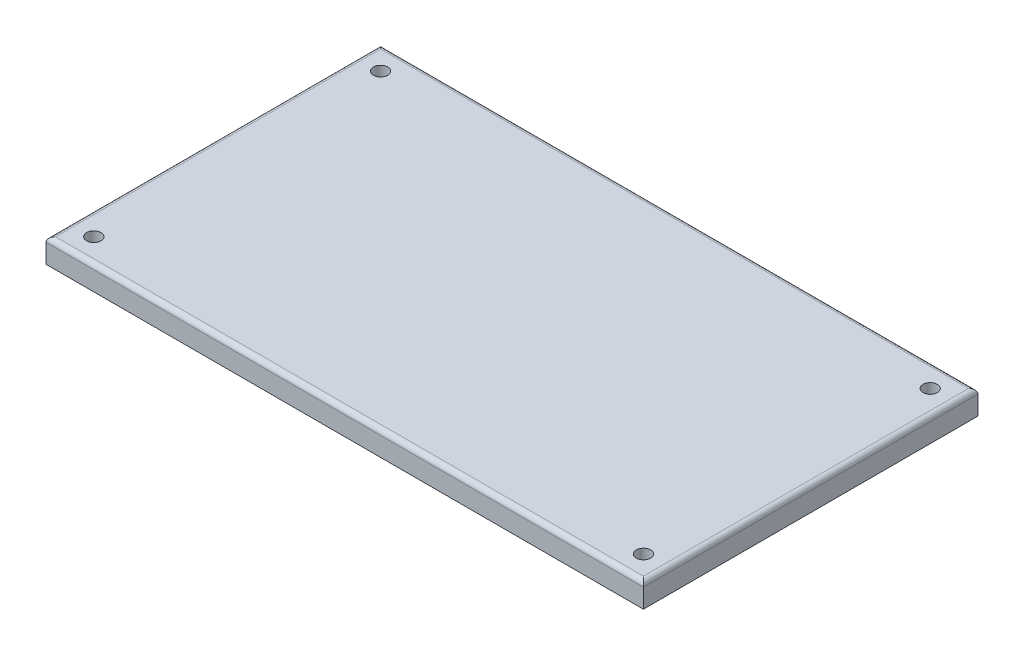
ISO-10303-21;
HEADER;
FILE_DESCRIPTION(('STEP AP214'),'2;1');
FILE_NAME('part.step','',(''),(''),'','','');
FILE_SCHEMA(('AUTOMOTIVE_DESIGN { 1 0 10303 214 1 1 1 1 }'));
ENDSEC;
DATA;
#1=APPLICATION_CONTEXT('core data for automotive mechanical design processes');
#2=APPLICATION_PROTOCOL_DEFINITION('international standard','automotive_design',2000,#1);
#3=PRODUCT_CONTEXT('',#1,'mechanical');
#4=PRODUCT('Part','Part','',(#3));
#5=PRODUCT_RELATED_PRODUCT_CATEGORY('part','',(#4));
#6=PRODUCT_DEFINITION_FORMATION('','',#4);
#7=PRODUCT_DEFINITION_CONTEXT('part definition',#1,'design');
#8=PRODUCT_DEFINITION('design','',#6,#7);
#9=PRODUCT_DEFINITION_SHAPE('','',#8);
#10=(LENGTH_UNIT() NAMED_UNIT(*) SI_UNIT(.MILLI.,.METRE.));
#11=(NAMED_UNIT(*) PLANE_ANGLE_UNIT() SI_UNIT($,.RADIAN.));
#12=(NAMED_UNIT(*) SI_UNIT($,.STERADIAN.) SOLID_ANGLE_UNIT());
#13=UNCERTAINTY_MEASURE_WITH_UNIT(LENGTH_MEASURE(1.E-05),#10,'distance_accuracy_value','');
#14=(GEOMETRIC_REPRESENTATION_CONTEXT(3) GLOBAL_UNCERTAINTY_ASSIGNED_CONTEXT((#13)) GLOBAL_UNIT_ASSIGNED_CONTEXT((#10,
#11,#12)) REPRESENTATION_CONTEXT('',''));
#15=CARTESIAN_POINT('',(0.,0.,0.));
#16=DIRECTION('',(0.,0.,1.));
#17=DIRECTION('',(1.,0.,0.));
#18=AXIS2_PLACEMENT_3D('',#15,#16,#17);
#19=CARTESIAN_POINT('',(0.,5.,0.));
#20=DIRECTION('',(1.,0.,0.));
#21=DIRECTION('',(0.,0.,-1.));
#22=AXIS2_PLACEMENT_3D('',#19,#20,#21);
#23=PLANE('',#22);
#24=DIRECTION('',(0.,-1.,0.));
#25=VECTOR('',#24,1.);
#26=CARTESIAN_POINT('',(0.,5.,0.));
#27=LINE('',#26,#25);
#28=CARTESIAN_POINT('',(0.,4.,0.));
#29=VERTEX_POINT('',#28);
#30=CARTESIAN_POINT('',(0.,0.,0.));
#31=VERTEX_POINT('',#30);
#32=EDGE_CURVE('E85',#29,#31,#27,.T.);
#33=ORIENTED_EDGE('',*,*,#32,.F.);
#34=DIRECTION('',(0.,0.,1.));
#35=VECTOR('',#34,1.);
#36=CARTESIAN_POINT('',(0.,4.,0.));
#37=LINE('',#36,#35);
#38=CARTESIAN_POINT('',(0.,4.,-70.));
#39=VERTEX_POINT('',#38);
#40=EDGE_CURVE('E42',#29,#39,#37,.F.);
#41=ORIENTED_EDGE('',*,*,#40,.T.);
#42=DIRECTION('',(0.,-1.,0.));
#43=VECTOR('',#42,1.);
#44=CARTESIAN_POINT('',(0.,5.,-70.));
#45=LINE('',#44,#43);
#46=CARTESIAN_POINT('',(0.,0.,-70.));
#47=VERTEX_POINT('',#46);
#48=EDGE_CURVE('E102',#39,#47,#45,.T.);
#49=ORIENTED_EDGE('',*,*,#48,.T.);
#50=DIRECTION('',(0.,0.,1.));
#51=VECTOR('',#50,1.);
#52=CARTESIAN_POINT('',(0.,0.,0.));
#53=LINE('',#52,#51);
#54=EDGE_CURVE('E98',#47,#31,#53,.T.);
#55=ORIENTED_EDGE('',*,*,#54,.T.);
#56=EDGE_LOOP('',(#33,#41,#49,#55));
#57=FACE_BOUND('',#56,.T.);
#58=ADVANCED_FACE('F33',(#57),#23,.F.);
#59=CARTESIAN_POINT('',(0.,5.,0.));
#60=DIRECTION('',(0.,0.,-1.));
#61=DIRECTION('',(-1.,0.,0.));
#62=AXIS2_PLACEMENT_3D('',#59,#60,#61);
#63=PLANE('',#62);
#64=DIRECTION('',(0.,-1.,0.));
#65=VECTOR('',#64,1.);
#66=CARTESIAN_POINT('',(125.,5.,0.));
#67=LINE('',#66,#65);
#68=CARTESIAN_POINT('',(125.,4.,0.));
#69=VERTEX_POINT('',#68);
#70=CARTESIAN_POINT('',(125.,0.,0.));
#71=VERTEX_POINT('',#70);
#72=EDGE_CURVE('E92',#69,#71,#67,.T.);
#73=ORIENTED_EDGE('',*,*,#72,.F.);
#74=DIRECTION('',(1.,0.,0.));
#75=VECTOR('',#74,1.);
#76=CARTESIAN_POINT('',(0.,4.,0.));
#77=LINE('',#76,#75);
#78=EDGE_CURVE('E57',#69,#29,#77,.F.);
#79=ORIENTED_EDGE('',*,*,#78,.T.);
#80=ORIENTED_EDGE('',*,*,#32,.T.);
#81=DIRECTION('',(1.,0.,0.));
#82=VECTOR('',#81,1.);
#83=CARTESIAN_POINT('',(0.,0.,0.));
#84=LINE('',#83,#82);
#85=EDGE_CURVE('E88',#31,#71,#84,.T.);
#86=ORIENTED_EDGE('',*,*,#85,.T.);
#87=EDGE_LOOP('',(#73,#79,#80,#86));
#88=FACE_BOUND('',#87,.T.);
#89=ADVANCED_FACE('F87',(#88),#63,.F.);
#90=CARTESIAN_POINT('',(125.,5.,0.));
#91=DIRECTION('',(-1.,0.,0.));
#92=DIRECTION('',(0.,0.,1.));
#93=AXIS2_PLACEMENT_3D('',#90,#91,#92);
#94=PLANE('',#93);
#95=DIRECTION('',(0.,-1.,0.));
#96=VECTOR('',#95,1.);
#97=CARTESIAN_POINT('',(125.,5.,-70.));
#98=LINE('',#97,#96);
#99=CARTESIAN_POINT('',(125.,4.,-70.));
#100=VERTEX_POINT('',#99);
#101=CARTESIAN_POINT('',(125.,0.,-70.));
#102=VERTEX_POINT('',#101);
#103=EDGE_CURVE('E115',#100,#102,#98,.T.);
#104=ORIENTED_EDGE('',*,*,#103,.F.);
#105=DIRECTION('',(0.,0.,-1.));
#106=VECTOR('',#105,1.);
#107=CARTESIAN_POINT('',(125.,4.,0.));
#108=LINE('',#107,#106);
#109=EDGE_CURVE('E126',#100,#69,#108,.F.);
#110=ORIENTED_EDGE('',*,*,#109,.T.);
#111=ORIENTED_EDGE('',*,*,#72,.T.);
#112=DIRECTION('',(0.,0.,-1.));
#113=VECTOR('',#112,1.);
#114=CARTESIAN_POINT('',(125.,0.,0.));
#115=LINE('',#114,#113);
#116=EDGE_CURVE('E100',#71,#102,#115,.T.);
#117=ORIENTED_EDGE('',*,*,#116,.T.);
#118=EDGE_LOOP('',(#104,#110,#111,#117));
#119=FACE_BOUND('',#118,.T.);
#120=ADVANCED_FACE('F155',(#119),#94,.F.);
#121=CARTESIAN_POINT('',(0.,5.,-70.));
#122=DIRECTION('',(0.,0.,1.));
#123=DIRECTION('',(1.,0.,0.));
#124=AXIS2_PLACEMENT_3D('',#121,#122,#123);
#125=PLANE('',#124);
#126=ORIENTED_EDGE('',*,*,#48,.F.);
#127=DIRECTION('',(-1.,0.,0.));
#128=VECTOR('',#127,1.);
#129=CARTESIAN_POINT('',(0.,4.,-70.));
#130=LINE('',#129,#128);
#131=EDGE_CURVE('E11',#39,#100,#130,.F.);
#132=ORIENTED_EDGE('',*,*,#131,.T.);
#133=ORIENTED_EDGE('',*,*,#103,.T.);
#134=DIRECTION('',(-1.,0.,0.));
#135=VECTOR('',#134,1.);
#136=CARTESIAN_POINT('',(0.,0.,-70.));
#137=LINE('',#136,#135);
#138=EDGE_CURVE('E112',#102,#47,#137,.T.);
#139=ORIENTED_EDGE('',*,*,#138,.T.);
#140=EDGE_LOOP('',(#126,#132,#133,#139));
#141=FACE_BOUND('',#140,.T.);
#142=ADVANCED_FACE('F157',(#141),#125,.F.);
#143=CARTESIAN_POINT('',(0.,5.,0.));
#144=DIRECTION('',(0.,-1.,0.));
#145=DIRECTION('',(0.,0.,-1.));
#146=AXIS2_PLACEMENT_3D('',#143,#144,#145);
#147=PLANE('',#146);
#148=CARTESIAN_POINT('',(5.,5.,-5.));
#149=DIRECTION('',(0.,1.,0.));
#150=DIRECTION('',(0.,0.,-1.));
#151=AXIS2_PLACEMENT_3D('',#148,#149,#150);
#152=CIRCLE('',#151,1.5);
#153=CARTESIAN_POINT('',(5.,5.,-6.5));
#154=VERTEX_POINT('',#153);
#155=EDGE_CURVE('E228',#154,#154,#152,.T.);
#156=ORIENTED_EDGE('',*,*,#155,.F.);
#157=EDGE_LOOP('',(#156));
#158=FACE_BOUND('',#157,.T.);
#159=CARTESIAN_POINT('',(5.,5.,-65.));
#160=DIRECTION('',(0.,1.,0.));
#161=DIRECTION('',(0.,0.,1.));
#162=AXIS2_PLACEMENT_3D('',#159,#160,#161);
#163=CIRCLE('',#162,1.49999999999999);
#164=CARTESIAN_POINT('',(5.,5.,-63.5));
#165=VERTEX_POINT('',#164);
#166=EDGE_CURVE('E220',#165,#165,#163,.T.);
#167=ORIENTED_EDGE('',*,*,#166,.F.);
#168=EDGE_LOOP('',(#167));
#169=FACE_BOUND('',#168,.T.);
#170=CARTESIAN_POINT('',(120.,5.,-65.));
#171=DIRECTION('',(0.,1.,0.));
#172=DIRECTION('',(0.,0.,-1.));
#173=AXIS2_PLACEMENT_3D('',#170,#171,#172);
#174=CIRCLE('',#173,1.49999999999999);
#175=CARTESIAN_POINT('',(120.,5.,-66.5));
#176=VERTEX_POINT('',#175);
#177=EDGE_CURVE('E216',#176,#176,#174,.T.);
#178=ORIENTED_EDGE('',*,*,#177,.F.);
#179=EDGE_LOOP('',(#178));
#180=FACE_BOUND('',#179,.T.);
#181=CARTESIAN_POINT('',(120.,5.,-5.));
#182=DIRECTION('',(0.,1.,0.));
#183=DIRECTION('',(0.,0.,1.));
#184=AXIS2_PLACEMENT_3D('',#181,#182,#183);
#185=CIRCLE('',#184,1.5);
#186=CARTESIAN_POINT('',(120.,5.,-3.5));
#187=VERTEX_POINT('',#186);
#188=EDGE_CURVE('E134',#187,#187,#185,.T.);
#189=ORIENTED_EDGE('',*,*,#188,.F.);
#190=EDGE_LOOP('',(#189));
#191=FACE_BOUND('',#190,.T.);
#192=DIRECTION('',(1.,0.,0.));
#193=VECTOR('',#192,1.);
#194=CARTESIAN_POINT('',(0.,5.,-1.));
#195=LINE('',#194,#193);
#196=CARTESIAN_POINT('',(1.,5.,-1.));
#197=VERTEX_POINT('',#196);
#198=CARTESIAN_POINT('',(124.,5.,-1.));
#199=VERTEX_POINT('',#198);
#200=EDGE_CURVE('E121',#197,#199,#195,.T.);
#201=ORIENTED_EDGE('',*,*,#200,.T.);
#202=DIRECTION('',(0.,0.,-1.));
#203=VECTOR('',#202,1.);
#204=CARTESIAN_POINT('',(124.,5.,0.));
#205=LINE('',#204,#203);
#206=CARTESIAN_POINT('',(124.,5.,-69.));
#207=VERTEX_POINT('',#206);
#208=EDGE_CURVE('E123',#199,#207,#205,.T.);
#209=ORIENTED_EDGE('',*,*,#208,.T.);
#210=DIRECTION('',(-1.,0.,0.));
#211=VECTOR('',#210,1.);
#212=CARTESIAN_POINT('',(0.,5.,-69.));
#213=LINE('',#212,#211);
#214=CARTESIAN_POINT('',(1.,5.,-69.));
#215=VERTEX_POINT('',#214);
#216=EDGE_CURVE('E91',#207,#215,#213,.T.);
#217=ORIENTED_EDGE('',*,*,#216,.T.);
#218=DIRECTION('',(0.,0.,1.));
#219=VECTOR('',#218,1.);
#220=CARTESIAN_POINT('',(1.,5.,0.));
#221=LINE('',#220,#219);
#222=EDGE_CURVE('E119',#215,#197,#221,.T.);
#223=ORIENTED_EDGE('',*,*,#222,.T.);
#224=EDGE_LOOP('',(#201,#209,#217,#223));
#225=FACE_BOUND('',#224,.T.);
#226=ADVANCED_FACE('F147',(#158,#169,#180,#191,#225),#147,.F.);
#227=CARTESIAN_POINT('',(0.,0.,0.));
#228=DIRECTION('',(0.,-1.,0.));
#229=DIRECTION('',(0.,0.,-1.));
#230=AXIS2_PLACEMENT_3D('',#227,#228,#229);
#231=PLANE('',#230);
#232=CARTESIAN_POINT('',(5.,0.,-5.));
#233=DIRECTION('',(0.,-1.,0.));
#234=DIRECTION('',(0.,0.,-1.));
#235=AXIS2_PLACEMENT_3D('',#232,#233,#234);
#236=CIRCLE('',#235,1.5);
#237=CARTESIAN_POINT('',(5.,0.,-6.5));
#238=VERTEX_POINT('',#237);
#239=EDGE_CURVE('E231',#238,#238,#236,.F.);
#240=ORIENTED_EDGE('',*,*,#239,.T.);
#241=EDGE_LOOP('',(#240));
#242=FACE_BOUND('',#241,.T.);
#243=CARTESIAN_POINT('',(5.,0.,-65.));
#244=DIRECTION('',(0.,-1.,0.));
#245=DIRECTION('',(0.,0.,-1.));
#246=AXIS2_PLACEMENT_3D('',#243,#244,#245);
#247=CIRCLE('',#246,1.49999999999999);
#248=CARTESIAN_POINT('',(5.,0.,-66.5));
#249=VERTEX_POINT('',#248);
#250=EDGE_CURVE('E225',#249,#249,#247,.F.);
#251=ORIENTED_EDGE('',*,*,#250,.T.);
#252=EDGE_LOOP('',(#251));
#253=FACE_BOUND('',#252,.T.);
#254=CARTESIAN_POINT('',(120.,0.,-65.));
#255=DIRECTION('',(0.,-1.,0.));
#256=DIRECTION('',(0.,0.,-1.));
#257=AXIS2_PLACEMENT_3D('',#254,#255,#256);
#258=CIRCLE('',#257,1.49999999999999);
#259=CARTESIAN_POINT('',(120.,0.,-66.5));
#260=VERTEX_POINT('',#259);
#261=EDGE_CURVE('E213',#260,#260,#258,.F.);
#262=ORIENTED_EDGE('',*,*,#261,.T.);
#263=EDGE_LOOP('',(#262));
#264=FACE_BOUND('',#263,.T.);
#265=CARTESIAN_POINT('',(120.,0.,-5.));
#266=DIRECTION('',(0.,-1.,0.));
#267=DIRECTION('',(0.,0.,-1.));
#268=AXIS2_PLACEMENT_3D('',#265,#266,#267);
#269=CIRCLE('',#268,1.5);
#270=CARTESIAN_POINT('',(120.,0.,-6.5));
#271=VERTEX_POINT('',#270);
#272=EDGE_CURVE('E108',#271,#271,#269,.F.);
#273=ORIENTED_EDGE('',*,*,#272,.T.);
#274=EDGE_LOOP('',(#273));
#275=FACE_BOUND('',#274,.T.);
#276=ORIENTED_EDGE('',*,*,#54,.F.);
#277=ORIENTED_EDGE('',*,*,#138,.F.);
#278=ORIENTED_EDGE('',*,*,#116,.F.);
#279=ORIENTED_EDGE('',*,*,#85,.F.);
#280=EDGE_LOOP('',(#276,#277,#278,#279));
#281=FACE_BOUND('',#280,.T.);
#282=ADVANCED_FACE('F96',(#242,#253,#264,#275,#281),#231,.T.);
#283=CARTESIAN_POINT('',(1.,4.,0.));
#284=DIRECTION('',(0.,0.,1.));
#285=DIRECTION('',(1.,0.,0.));
#286=AXIS2_PLACEMENT_3D('',#283,#284,#285);
#287=CYLINDRICAL_SURFACE('',#286,1.);
#288=CARTESIAN_POINT('',(1.,4.,-69.));
#289=DIRECTION('',(-0.707106781186547,0.,0.707106781186547));
#290=DIRECTION('',(-0.707106781186547,0.,-0.707106781186547));
#291=AXIS2_PLACEMENT_3D('',#288,#289,#290);
#292=ELLIPSE('',#291,1.41421356237309,1.);
#293=EDGE_CURVE('E106',#39,#215,#292,.F.);
#294=ORIENTED_EDGE('',*,*,#293,.F.);
#295=ORIENTED_EDGE('',*,*,#40,.F.);
#296=CARTESIAN_POINT('',(1.,4.,-1.));
#297=DIRECTION('',(0.707106781186547,0.,0.707106781186547));
#298=DIRECTION('',(-0.707106781186547,0.,0.707106781186547));
#299=AXIS2_PLACEMENT_3D('',#296,#297,#298);
#300=ELLIPSE('',#299,1.41421356237309,1.);
#301=EDGE_CURVE('E37',#197,#29,#300,.T.);
#302=ORIENTED_EDGE('',*,*,#301,.F.);
#303=ORIENTED_EDGE('',*,*,#222,.F.);
#304=EDGE_LOOP('',(#294,#295,#302,#303));
#305=FACE_BOUND('',#304,.T.);
#306=ADVANCED_FACE('F35',(#305),#287,.T.);
#307=CARTESIAN_POINT('',(0.,4.,-1.));
#308=DIRECTION('',(1.,0.,0.));
#309=DIRECTION('',(0.,0.,-1.));
#310=AXIS2_PLACEMENT_3D('',#307,#308,#309);
#311=CYLINDRICAL_SURFACE('',#310,1.);
#312=ORIENTED_EDGE('',*,*,#301,.T.);
#313=ORIENTED_EDGE('',*,*,#78,.F.);
#314=CARTESIAN_POINT('',(124.,4.,-1.));
#315=DIRECTION('',(0.707106781186547,0.,-0.707106781186547));
#316=DIRECTION('',(0.707106781186547,0.,0.707106781186547));
#317=AXIS2_PLACEMENT_3D('',#314,#315,#316);
#318=ELLIPSE('',#317,1.41421356237309,1.);
#319=EDGE_CURVE('E133',#199,#69,#318,.T.);
#320=ORIENTED_EDGE('',*,*,#319,.F.);
#321=ORIENTED_EDGE('',*,*,#200,.F.);
#322=EDGE_LOOP('',(#312,#313,#320,#321));
#323=FACE_BOUND('',#322,.T.);
#324=ADVANCED_FACE('F179',(#323),#311,.T.);
#325=CARTESIAN_POINT('',(0.,4.,-69.));
#326=DIRECTION('',(-1.,0.,0.));
#327=DIRECTION('',(0.,0.,1.));
#328=AXIS2_PLACEMENT_3D('',#325,#326,#327);
#329=CYLINDRICAL_SURFACE('',#328,1.);
#330=ORIENTED_EDGE('',*,*,#293,.T.);
#331=ORIENTED_EDGE('',*,*,#216,.F.);
#332=CARTESIAN_POINT('',(124.,4.,-69.));
#333=DIRECTION('',(-0.707106781186547,0.,-0.707106781186547));
#334=DIRECTION('',(-0.707106781186547,0.,0.707106781186547));
#335=AXIS2_PLACEMENT_3D('',#332,#333,#334);
#336=ELLIPSE('',#335,1.41421356237309,1.);
#337=EDGE_CURVE('E131',#100,#207,#336,.F.);
#338=ORIENTED_EDGE('',*,*,#337,.F.);
#339=ORIENTED_EDGE('',*,*,#131,.F.);
#340=EDGE_LOOP('',(#330,#331,#338,#339));
#341=FACE_BOUND('',#340,.T.);
#342=ADVANCED_FACE('F140',(#341),#329,.T.);
#343=CARTESIAN_POINT('',(124.,4.,0.));
#344=DIRECTION('',(0.,0.,-1.));
#345=DIRECTION('',(-1.,0.,0.));
#346=AXIS2_PLACEMENT_3D('',#343,#344,#345);
#347=CYLINDRICAL_SURFACE('',#346,1.);
#348=ORIENTED_EDGE('',*,*,#319,.T.);
#349=ORIENTED_EDGE('',*,*,#109,.F.);
#350=ORIENTED_EDGE('',*,*,#337,.T.);
#351=ORIENTED_EDGE('',*,*,#208,.F.);
#352=EDGE_LOOP('',(#348,#349,#350,#351));
#353=FACE_BOUND('',#352,.T.);
#354=ADVANCED_FACE('F151',(#353),#347,.T.);
#355=CARTESIAN_POINT('',(120.,-0.00100000000000013,-5.));
#356=DIRECTION('',(0.,1.,0.));
#357=DIRECTION('',(0.,0.,1.));
#358=AXIS2_PLACEMENT_3D('',#355,#356,#357);
#359=CYLINDRICAL_SURFACE('',#358,1.5);
#360=ORIENTED_EDGE('',*,*,#272,.F.);
#361=EDGE_LOOP('',(#360));
#362=FACE_BOUND('',#361,.T.);
#363=ORIENTED_EDGE('',*,*,#188,.T.);
#364=EDGE_LOOP('',(#363));
#365=FACE_BOUND('',#364,.T.);
#366=ADVANCED_FACE('F177',(#362,#365),#359,.F.);
#367=CARTESIAN_POINT('',(120.,-0.00100000000000013,-65.));
#368=DIRECTION('',(0.,1.,0.));
#369=DIRECTION('',(0.,0.,1.));
#370=AXIS2_PLACEMENT_3D('',#367,#368,#369);
#371=CYLINDRICAL_SURFACE('',#370,1.49999999999999);
#372=ORIENTED_EDGE('',*,*,#261,.F.);
#373=EDGE_LOOP('',(#372));
#374=FACE_BOUND('',#373,.T.);
#375=ORIENTED_EDGE('',*,*,#177,.T.);
#376=EDGE_LOOP('',(#375));
#377=FACE_BOUND('',#376,.T.);
#378=ADVANCED_FACE('F196',(#374,#377),#371,.F.);
#379=CARTESIAN_POINT('',(5.,-0.00100000000000013,-65.));
#380=DIRECTION('',(0.,1.,0.));
#381=DIRECTION('',(0.,0.,1.));
#382=AXIS2_PLACEMENT_3D('',#379,#380,#381);
#383=CYLINDRICAL_SURFACE('',#382,1.49999999999999);
#384=ORIENTED_EDGE('',*,*,#250,.F.);
#385=EDGE_LOOP('',(#384));
#386=FACE_BOUND('',#385,.T.);
#387=ORIENTED_EDGE('',*,*,#166,.T.);
#388=EDGE_LOOP('',(#387));
#389=FACE_BOUND('',#388,.T.);
#390=ADVANCED_FACE('F201',(#386,#389),#383,.F.);
#391=CARTESIAN_POINT('',(5.,-0.00100000000000013,-5.));
#392=DIRECTION('',(0.,1.,0.));
#393=DIRECTION('',(0.,0.,1.));
#394=AXIS2_PLACEMENT_3D('',#391,#392,#393);
#395=CYLINDRICAL_SURFACE('',#394,1.5);
#396=ORIENTED_EDGE('',*,*,#239,.F.);
#397=EDGE_LOOP('',(#396));
#398=FACE_BOUND('',#397,.T.);
#399=ORIENTED_EDGE('',*,*,#155,.T.);
#400=EDGE_LOOP('',(#399));
#401=FACE_BOUND('',#400,.T.);
#402=ADVANCED_FACE('F198',(#398,#401),#395,.F.);
#403=CLOSED_SHELL('',(#58,#89,#120,#142,#226,#282,#306,#324,#342,#354,#366,#378,#390,#402));
#404=MANIFOLD_SOLID_BREP('B2',#403);
#405=ADVANCED_BREP_SHAPE_REPRESENTATION('',(#18,#404),#14);
#406=SHAPE_DEFINITION_REPRESENTATION(#9,#405);
ENDSEC;
END-ISO-10303-21;
